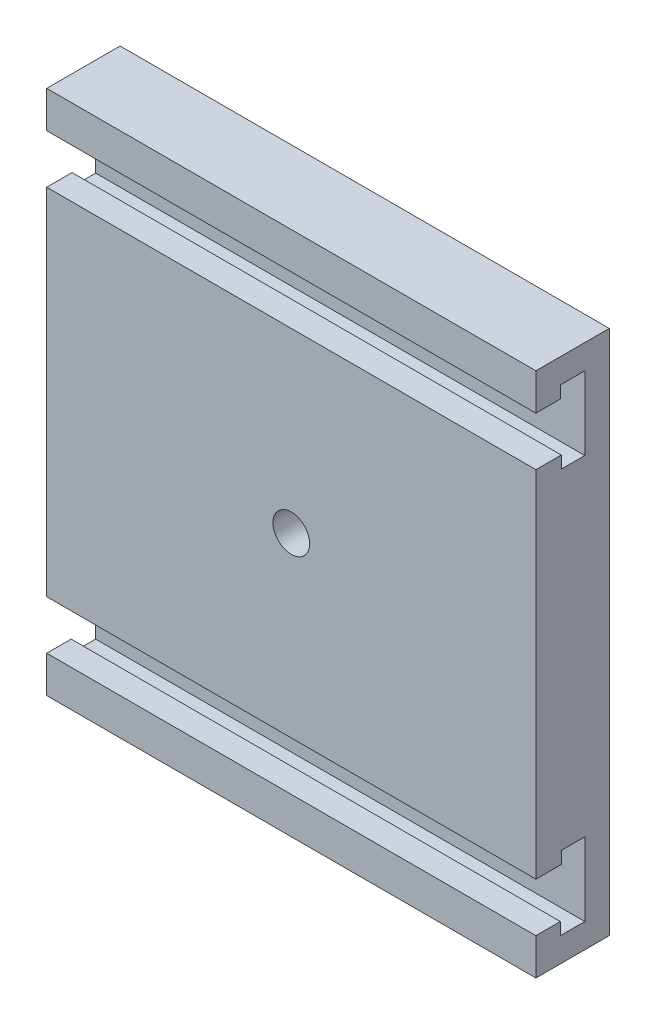
ISO-10303-21;
HEADER;
FILE_DESCRIPTION(('STEP AP214'),'2;1');
FILE_NAME('part.step','',(''),(''),'','','');
FILE_SCHEMA(('AUTOMOTIVE_DESIGN { 1 0 10303 214 1 1 1 1 }'));
ENDSEC;
DATA;
#1=APPLICATION_CONTEXT('core data for automotive mechanical design processes');
#2=APPLICATION_PROTOCOL_DEFINITION('international standard','automotive_design',2000,#1);
#3=PRODUCT_CONTEXT('',#1,'mechanical');
#4=PRODUCT('Part','Part','',(#3));
#5=PRODUCT_RELATED_PRODUCT_CATEGORY('part','',(#4));
#6=PRODUCT_DEFINITION_FORMATION('','',#4);
#7=PRODUCT_DEFINITION_CONTEXT('part definition',#1,'design');
#8=PRODUCT_DEFINITION('design','',#6,#7);
#9=PRODUCT_DEFINITION_SHAPE('','',#8);
#10=(LENGTH_UNIT() NAMED_UNIT(*) SI_UNIT(.MILLI.,.METRE.));
#11=(NAMED_UNIT(*) PLANE_ANGLE_UNIT() SI_UNIT($,.RADIAN.));
#12=(NAMED_UNIT(*) SI_UNIT($,.STERADIAN.) SOLID_ANGLE_UNIT());
#13=UNCERTAINTY_MEASURE_WITH_UNIT(LENGTH_MEASURE(1.E-05),#10,'distance_accuracy_value','');
#14=(GEOMETRIC_REPRESENTATION_CONTEXT(3) GLOBAL_UNCERTAINTY_ASSIGNED_CONTEXT((#13)) GLOBAL_UNIT_ASSIGNED_CONTEXT((#10,
#11,#12)) REPRESENTATION_CONTEXT('',''));
#15=CARTESIAN_POINT('',(0.,0.,0.));
#16=DIRECTION('',(0.,0.,1.));
#17=DIRECTION('',(1.,0.,0.));
#18=AXIS2_PLACEMENT_3D('',#15,#16,#17);
#19=CARTESIAN_POINT('',(0.,0.,6.));
#20=DIRECTION('',(0.,0.,-1.));
#21=DIRECTION('',(-1.,0.,0.));
#22=AXIS2_PLACEMENT_3D('',#19,#20,#21);
#23=PLANE('',#22);
#24=DIRECTION('',(0.,-1.,0.));
#25=VECTOR('',#24,1.);
#26=CARTESIAN_POINT('',(-20.,-21.5,6.));
#27=LINE('',#26,#25);
#28=CARTESIAN_POINT('',(-20.,21.5,6.));
#29=VERTEX_POINT('',#28);
#30=CARTESIAN_POINT('',(-20.,18.5,6.));
#31=VERTEX_POINT('',#30);
#32=EDGE_CURVE('E198',#29,#31,#27,.T.);
#33=ORIENTED_EDGE('',*,*,#32,.T.);
#34=DIRECTION('',(1.,0.,0.));
#35=VECTOR('',#34,1.);
#36=CARTESIAN_POINT('',(-20.,18.5,6.));
#37=LINE('',#36,#35);
#38=CARTESIAN_POINT('',(20.,18.5,6.));
#39=VERTEX_POINT('',#38);
#40=EDGE_CURVE('E256',#31,#39,#37,.T.);
#41=ORIENTED_EDGE('',*,*,#40,.T.);
#42=DIRECTION('',(0.,1.,0.));
#43=VECTOR('',#42,1.);
#44=CARTESIAN_POINT('',(20.,-21.5,6.));
#45=LINE('',#44,#43);
#46=CARTESIAN_POINT('',(20.,21.5,6.));
#47=VERTEX_POINT('',#46);
#48=EDGE_CURVE('E219',#39,#47,#45,.T.);
#49=ORIENTED_EDGE('',*,*,#48,.T.);
#50=DIRECTION('',(-1.,0.,0.));
#51=VECTOR('',#50,1.);
#52=CARTESIAN_POINT('',(-20.,21.5,6.));
#53=LINE('',#52,#51);
#54=EDGE_CURVE('E203',#47,#29,#53,.T.);
#55=ORIENTED_EDGE('',*,*,#54,.T.);
#56=EDGE_LOOP('',(#33,#41,#49,#55));
#57=FACE_BOUND('',#56,.T.);
#58=ADVANCED_FACE('F34',(#57),#23,.F.);
#59=CARTESIAN_POINT('',(20.,-21.5,6.));
#60=VERTEX_POINT('',#59);
#61=CARTESIAN_POINT('',(20.,-18.5,6.));
#62=VERTEX_POINT('',#61);
#63=EDGE_CURVE('E247',#60,#62,#45,.T.);
#64=ORIENTED_EDGE('',*,*,#63,.T.);
#65=DIRECTION('',(1.,0.,0.));
#66=VECTOR('',#65,1.);
#67=CARTESIAN_POINT('',(-20.,-18.5,6.));
#68=LINE('',#67,#66);
#69=CARTESIAN_POINT('',(-20.,-18.5,6.));
#70=VERTEX_POINT('',#69);
#71=EDGE_CURVE('E401',#70,#62,#68,.T.);
#72=ORIENTED_EDGE('',*,*,#71,.F.);
#73=CARTESIAN_POINT('',(-20.,-21.5,6.));
#74=VERTEX_POINT('',#73);
#75=EDGE_CURVE('E199',#70,#74,#27,.T.);
#76=ORIENTED_EDGE('',*,*,#75,.T.);
#77=DIRECTION('',(1.,0.,0.));
#78=VECTOR('',#77,1.);
#79=CARTESIAN_POINT('',(-20.,-21.5,6.));
#80=LINE('',#79,#78);
#81=EDGE_CURVE('E202',#74,#60,#80,.T.);
#82=ORIENTED_EDGE('',*,*,#81,.T.);
#83=EDGE_LOOP('',(#64,#72,#76,#82));
#84=FACE_BOUND('',#83,.T.);
#85=ADVANCED_FACE('F266',(#84),#23,.F.);
#86=CARTESIAN_POINT('',(20.,-14.5,6.));
#87=VERTEX_POINT('',#86);
#88=CARTESIAN_POINT('',(20.,14.5,6.));
#89=VERTEX_POINT('',#88);
#90=EDGE_CURVE('E189',#87,#89,#45,.T.);
#91=ORIENTED_EDGE('',*,*,#90,.T.);
#92=DIRECTION('',(1.,0.,0.));
#93=VECTOR('',#92,1.);
#94=CARTESIAN_POINT('',(-20.,14.5,6.));
#95=LINE('',#94,#93);
#96=CARTESIAN_POINT('',(-20.,14.5,6.));
#97=VERTEX_POINT('',#96);
#98=EDGE_CURVE('E174',#97,#89,#95,.T.);
#99=ORIENTED_EDGE('',*,*,#98,.F.);
#100=CARTESIAN_POINT('',(-20.,-14.5,6.));
#101=VERTEX_POINT('',#100);
#102=EDGE_CURVE('E187',#97,#101,#27,.T.);
#103=ORIENTED_EDGE('',*,*,#102,.T.);
#104=DIRECTION('',(1.,0.,0.));
#105=VECTOR('',#104,1.);
#106=CARTESIAN_POINT('',(-20.,-14.5,6.));
#107=LINE('',#106,#105);
#108=EDGE_CURVE('E404',#101,#87,#107,.T.);
#109=ORIENTED_EDGE('',*,*,#108,.T.);
#110=EDGE_LOOP('',(#91,#99,#103,#109));
#111=FACE_BOUND('',#110,.T.);
#112=CARTESIAN_POINT('',(0.,0.,6.));
#113=DIRECTION('',(0.,0.,1.));
#114=DIRECTION('',(1.,0.,0.));
#115=AXIS2_PLACEMENT_3D('',#112,#113,#114);
#116=CIRCLE('',#115,1.5);
#117=CARTESIAN_POINT('',(1.50000000000001,0.,6.));
#118=VERTEX_POINT('',#117);
#119=EDGE_CURVE('E213',#118,#118,#116,.T.);
#120=ORIENTED_EDGE('',*,*,#119,.F.);
#121=EDGE_LOOP('',(#120));
#122=FACE_BOUND('',#121,.T.);
#123=ADVANCED_FACE('F184',(#111,#122),#23,.F.);
#124=CARTESIAN_POINT('',(0.,0.,0.));
#125=DIRECTION('',(0.,0.,-1.));
#126=DIRECTION('',(-1.,0.,0.));
#127=AXIS2_PLACEMENT_3D('',#124,#125,#126);
#128=PLANE('',#127);
#129=DIRECTION('',(0.,1.,0.));
#130=VECTOR('',#129,1.);
#131=CARTESIAN_POINT('',(20.,-21.5,0.));
#132=LINE('',#131,#130);
#133=CARTESIAN_POINT('',(20.,-21.5,0.));
#134=VERTEX_POINT('',#133);
#135=CARTESIAN_POINT('',(20.,21.5,0.));
#136=VERTEX_POINT('',#135);
#137=EDGE_CURVE('E209',#134,#136,#132,.T.);
#138=ORIENTED_EDGE('',*,*,#137,.F.);
#139=DIRECTION('',(1.,0.,0.));
#140=VECTOR('',#139,1.);
#141=CARTESIAN_POINT('',(-20.,-21.5,0.));
#142=LINE('',#141,#140);
#143=CARTESIAN_POINT('',(-20.,-21.5,0.));
#144=VERTEX_POINT('',#143);
#145=EDGE_CURVE('E217',#144,#134,#142,.T.);
#146=ORIENTED_EDGE('',*,*,#145,.F.);
#147=DIRECTION('',(0.,-1.,0.));
#148=VECTOR('',#147,1.);
#149=CARTESIAN_POINT('',(-20.,-21.5,0.));
#150=LINE('',#149,#148);
#151=CARTESIAN_POINT('',(-20.,21.5,0.));
#152=VERTEX_POINT('',#151);
#153=EDGE_CURVE('E215',#152,#144,#150,.T.);
#154=ORIENTED_EDGE('',*,*,#153,.F.);
#155=DIRECTION('',(-1.,0.,0.));
#156=VECTOR('',#155,1.);
#157=CARTESIAN_POINT('',(-20.,21.5,0.));
#158=LINE('',#157,#156);
#159=EDGE_CURVE('E212',#136,#152,#158,.T.);
#160=ORIENTED_EDGE('',*,*,#159,.F.);
#161=EDGE_LOOP('',(#138,#146,#154,#160));
#162=FACE_BOUND('',#161,.T.);
#163=CARTESIAN_POINT('',(0.,0.,0.));
#164=DIRECTION('',(0.,0.,1.));
#165=DIRECTION('',(1.,0.,0.));
#166=AXIS2_PLACEMENT_3D('',#163,#164,#165);
#167=CIRCLE('',#166,1.5);
#168=CARTESIAN_POINT('',(1.50000000000001,0.,0.));
#169=VERTEX_POINT('',#168);
#170=EDGE_CURVE('E355',#169,#169,#167,.T.);
#171=ORIENTED_EDGE('',*,*,#170,.T.);
#172=EDGE_LOOP('',(#171));
#173=FACE_BOUND('',#172,.T.);
#174=ADVANCED_FACE('F235',(#162,#173),#128,.T.);
#175=CARTESIAN_POINT('',(20.,-21.5,6.));
#176=DIRECTION('',(-1.,0.,0.));
#177=DIRECTION('',(0.,0.,1.));
#178=AXIS2_PLACEMENT_3D('',#175,#176,#177);
#179=PLANE('',#178);
#180=ORIENTED_EDGE('',*,*,#48,.F.);
#181=DIRECTION('',(0.,0.,1.));
#182=VECTOR('',#181,1.);
#183=CARTESIAN_POINT('',(20.,18.5,6.));
#184=LINE('',#183,#182);
#185=CARTESIAN_POINT('',(20.,18.5,4.));
#186=VERTEX_POINT('',#185);
#187=EDGE_CURVE('E179',#186,#39,#184,.T.);
#188=ORIENTED_EDGE('',*,*,#187,.F.);
#189=DIRECTION('',(0.,-1.,0.));
#190=VECTOR('',#189,1.);
#191=CARTESIAN_POINT('',(20.,18.5,4.));
#192=LINE('',#191,#190);
#193=CARTESIAN_POINT('',(20.,19.5,4.));
#194=VERTEX_POINT('',#193);
#195=EDGE_CURVE('E348',#194,#186,#192,.T.);
#196=ORIENTED_EDGE('',*,*,#195,.F.);
#197=DIRECTION('',(0.,0.,1.));
#198=VECTOR('',#197,1.);
#199=CARTESIAN_POINT('',(20.,19.5,4.));
#200=LINE('',#199,#198);
#201=CARTESIAN_POINT('',(20.,19.5,2.));
#202=VERTEX_POINT('',#201);
#203=EDGE_CURVE('E350',#202,#194,#200,.T.);
#204=ORIENTED_EDGE('',*,*,#203,.F.);
#205=DIRECTION('',(0.,1.,0.));
#206=VECTOR('',#205,1.);
#207=CARTESIAN_POINT('',(20.,19.5,2.));
#208=LINE('',#207,#206);
#209=CARTESIAN_POINT('',(20.,13.5,2.));
#210=VERTEX_POINT('',#209);
#211=EDGE_CURVE('E442',#210,#202,#208,.T.);
#212=ORIENTED_EDGE('',*,*,#211,.F.);
#213=DIRECTION('',(0.,0.,-1.));
#214=VECTOR('',#213,1.);
#215=CARTESIAN_POINT('',(20.,13.5,2.));
#216=LINE('',#215,#214);
#217=CARTESIAN_POINT('',(20.,13.5,3.92597341943154));
#218=VERTEX_POINT('',#217);
#219=EDGE_CURVE('E435',#218,#210,#216,.T.);
#220=ORIENTED_EDGE('',*,*,#219,.F.);
#221=DIRECTION('',(0.,-1.,0.));
#222=VECTOR('',#221,1.);
#223=CARTESIAN_POINT('',(20.,13.5,3.92597341943154));
#224=LINE('',#223,#222);
#225=CARTESIAN_POINT('',(20.,14.5,3.92597341943154));
#226=VERTEX_POINT('',#225);
#227=EDGE_CURVE('E433',#226,#218,#224,.T.);
#228=ORIENTED_EDGE('',*,*,#227,.F.);
#229=DIRECTION('',(0.,0.,-1.));
#230=VECTOR('',#229,1.);
#231=CARTESIAN_POINT('',(20.,14.5,3.92597341943154));
#232=LINE('',#231,#230);
#233=EDGE_CURVE('E403',#89,#226,#232,.T.);
#234=ORIENTED_EDGE('',*,*,#233,.F.);
#235=ORIENTED_EDGE('',*,*,#90,.F.);
#236=DIRECTION('',(0.,0.,1.));
#237=VECTOR('',#236,1.);
#238=CARTESIAN_POINT('',(20.,-14.5,3.92597341943154));
#239=LINE('',#238,#237);
#240=CARTESIAN_POINT('',(20.,-14.5,3.92597341943154));
#241=VERTEX_POINT('',#240);
#242=EDGE_CURVE('E370',#241,#87,#239,.T.);
#243=ORIENTED_EDGE('',*,*,#242,.F.);
#244=DIRECTION('',(0.,-1.,0.));
#245=VECTOR('',#244,1.);
#246=CARTESIAN_POINT('',(20.,-13.5,3.92597341943154));
#247=LINE('',#246,#245);
#248=CARTESIAN_POINT('',(20.,-13.5,3.92597341943154));
#249=VERTEX_POINT('',#248);
#250=EDGE_CURVE('E397',#249,#241,#247,.T.);
#251=ORIENTED_EDGE('',*,*,#250,.F.);
#252=DIRECTION('',(0.,0.,1.));
#253=VECTOR('',#252,1.);
#254=CARTESIAN_POINT('',(20.,-13.5,2.));
#255=LINE('',#254,#253);
#256=CARTESIAN_POINT('',(20.,-13.5,2.));
#257=VERTEX_POINT('',#256);
#258=EDGE_CURVE('E394',#257,#249,#255,.T.);
#259=ORIENTED_EDGE('',*,*,#258,.F.);
#260=DIRECTION('',(0.,1.,0.));
#261=VECTOR('',#260,1.);
#262=CARTESIAN_POINT('',(20.,-19.5,2.));
#263=LINE('',#262,#261);
#264=CARTESIAN_POINT('',(20.,-19.5,2.));
#265=VERTEX_POINT('',#264);
#266=EDGE_CURVE('E391',#265,#257,#263,.T.);
#267=ORIENTED_EDGE('',*,*,#266,.F.);
#268=DIRECTION('',(0.,0.,-1.));
#269=VECTOR('',#268,1.);
#270=CARTESIAN_POINT('',(20.,-19.5,4.));
#271=LINE('',#270,#269);
#272=CARTESIAN_POINT('',(20.,-19.5,4.));
#273=VERTEX_POINT('',#272);
#274=EDGE_CURVE('E388',#273,#265,#271,.T.);
#275=ORIENTED_EDGE('',*,*,#274,.F.);
#276=DIRECTION('',(0.,-1.,0.));
#277=VECTOR('',#276,1.);
#278=CARTESIAN_POINT('',(20.,-18.5,4.));
#279=LINE('',#278,#277);
#280=CARTESIAN_POINT('',(20.,-18.5,4.));
#281=VERTEX_POINT('',#280);
#282=EDGE_CURVE('E385',#281,#273,#279,.T.);
#283=ORIENTED_EDGE('',*,*,#282,.F.);
#284=DIRECTION('',(0.,0.,-1.));
#285=VECTOR('',#284,1.);
#286=CARTESIAN_POINT('',(20.,-18.5,6.));
#287=LINE('',#286,#285);
#288=EDGE_CURVE('E250',#62,#281,#287,.T.);
#289=ORIENTED_EDGE('',*,*,#288,.F.);
#290=ORIENTED_EDGE('',*,*,#63,.F.);
#291=DIRECTION('',(0.,0.,-1.));
#292=VECTOR('',#291,1.);
#293=CARTESIAN_POINT('',(20.,-21.5,6.));
#294=LINE('',#293,#292);
#295=EDGE_CURVE('E208',#60,#134,#294,.T.);
#296=ORIENTED_EDGE('',*,*,#295,.T.);
#297=ORIENTED_EDGE('',*,*,#137,.T.);
#298=DIRECTION('',(0.,0.,-1.));
#299=VECTOR('',#298,1.);
#300=CARTESIAN_POINT('',(20.,21.5,6.));
#301=LINE('',#300,#299);
#302=EDGE_CURVE('E11',#47,#136,#301,.T.);
#303=ORIENTED_EDGE('',*,*,#302,.F.);
#304=EDGE_LOOP('',(#180,#188,#196,#204,#212,#220,#228,#234,#235,#243,#251,#259,#267,#275,#283,
#289,#290,#296,#297,#303));
#305=FACE_BOUND('',#304,.T.);
#306=ADVANCED_FACE('F36',(#305),#179,.F.);
#307=CARTESIAN_POINT('',(-20.,21.5,6.));
#308=DIRECTION('',(0.,-1.,0.));
#309=DIRECTION('',(0.,0.,-1.));
#310=AXIS2_PLACEMENT_3D('',#307,#308,#309);
#311=PLANE('',#310);
#312=ORIENTED_EDGE('',*,*,#159,.T.);
#313=DIRECTION('',(0.,0.,-1.));
#314=VECTOR('',#313,1.);
#315=CARTESIAN_POINT('',(-20.,21.5,6.));
#316=LINE('',#315,#314);
#317=EDGE_CURVE('E42',#29,#152,#316,.T.);
#318=ORIENTED_EDGE('',*,*,#317,.F.);
#319=ORIENTED_EDGE('',*,*,#54,.F.);
#320=ORIENTED_EDGE('',*,*,#302,.T.);
#321=EDGE_LOOP('',(#312,#318,#319,#320));
#322=FACE_BOUND('',#321,.T.);
#323=ADVANCED_FACE('F258',(#322),#311,.F.);
#324=CARTESIAN_POINT('',(-20.,-21.5,6.));
#325=DIRECTION('',(1.,0.,0.));
#326=DIRECTION('',(0.,0.,-1.));
#327=AXIS2_PLACEMENT_3D('',#324,#325,#326);
#328=PLANE('',#327);
#329=DIRECTION('',(0.,-1.,0.));
#330=VECTOR('',#329,1.);
#331=CARTESIAN_POINT('',(-20.,18.5,4.));
#332=LINE('',#331,#330);
#333=CARTESIAN_POINT('',(-20.,19.5,4.));
#334=VERTEX_POINT('',#333);
#335=CARTESIAN_POINT('',(-20.,18.5,4.));
#336=VERTEX_POINT('',#335);
#337=EDGE_CURVE('E449',#334,#336,#332,.T.);
#338=ORIENTED_EDGE('',*,*,#337,.T.);
#339=DIRECTION('',(0.,0.,1.));
#340=VECTOR('',#339,1.);
#341=CARTESIAN_POINT('',(-20.,18.5,6.));
#342=LINE('',#341,#340);
#343=EDGE_CURVE('E190',#336,#31,#342,.T.);
#344=ORIENTED_EDGE('',*,*,#343,.T.);
#345=ORIENTED_EDGE('',*,*,#32,.F.);
#346=ORIENTED_EDGE('',*,*,#317,.T.);
#347=ORIENTED_EDGE('',*,*,#153,.T.);
#348=DIRECTION('',(0.,0.,-1.));
#349=VECTOR('',#348,1.);
#350=CARTESIAN_POINT('',(-20.,-21.5,6.));
#351=LINE('',#350,#349);
#352=EDGE_CURVE('E222',#74,#144,#351,.T.);
#353=ORIENTED_EDGE('',*,*,#352,.F.);
#354=ORIENTED_EDGE('',*,*,#75,.F.);
#355=DIRECTION('',(0.,0.,-1.));
#356=VECTOR('',#355,1.);
#357=CARTESIAN_POINT('',(-20.,-18.5,6.));
#358=LINE('',#357,#356);
#359=CARTESIAN_POINT('',(-20.,-18.5,4.));
#360=VERTEX_POINT('',#359);
#361=EDGE_CURVE('E366',#70,#360,#358,.T.);
#362=ORIENTED_EDGE('',*,*,#361,.T.);
#363=DIRECTION('',(0.,-1.,0.));
#364=VECTOR('',#363,1.);
#365=CARTESIAN_POINT('',(-20.,-18.5,4.));
#366=LINE('',#365,#364);
#367=CARTESIAN_POINT('',(-20.,-19.5,4.));
#368=VERTEX_POINT('',#367);
#369=EDGE_CURVE('E369',#360,#368,#366,.T.);
#370=ORIENTED_EDGE('',*,*,#369,.T.);
#371=DIRECTION('',(0.,0.,-1.));
#372=VECTOR('',#371,1.);
#373=CARTESIAN_POINT('',(-20.,-19.5,4.));
#374=LINE('',#373,#372);
#375=CARTESIAN_POINT('',(-20.,-19.5,2.));
#376=VERTEX_POINT('',#375);
#377=EDGE_CURVE('E57',#368,#376,#374,.T.);
#378=ORIENTED_EDGE('',*,*,#377,.T.);
#379=DIRECTION('',(0.,1.,0.));
#380=VECTOR('',#379,1.);
#381=CARTESIAN_POINT('',(-20.,-19.5,2.));
#382=LINE('',#381,#380);
#383=CARTESIAN_POINT('',(-20.,-13.5,2.));
#384=VERTEX_POINT('',#383);
#385=EDGE_CURVE('E374',#376,#384,#382,.T.);
#386=ORIENTED_EDGE('',*,*,#385,.T.);
#387=DIRECTION('',(0.,0.,1.));
#388=VECTOR('',#387,1.);
#389=CARTESIAN_POINT('',(-20.,-13.5,2.));
#390=LINE('',#389,#388);
#391=CARTESIAN_POINT('',(-20.,-13.5,3.92597341943154));
#392=VERTEX_POINT('',#391);
#393=EDGE_CURVE('E377',#384,#392,#390,.T.);
#394=ORIENTED_EDGE('',*,*,#393,.T.);
#395=DIRECTION('',(0.,-1.,0.));
#396=VECTOR('',#395,1.);
#397=CARTESIAN_POINT('',(-20.,-13.5,3.92597341943154));
#398=LINE('',#397,#396);
#399=CARTESIAN_POINT('',(-20.,-14.5,3.92597341943154));
#400=VERTEX_POINT('',#399);
#401=EDGE_CURVE('E380',#392,#400,#398,.T.);
#402=ORIENTED_EDGE('',*,*,#401,.T.);
#403=DIRECTION('',(0.,0.,1.));
#404=VECTOR('',#403,1.);
#405=CARTESIAN_POINT('',(-20.,-14.5,3.92597341943154));
#406=LINE('',#405,#404);
#407=EDGE_CURVE('E197',#400,#101,#406,.T.);
#408=ORIENTED_EDGE('',*,*,#407,.T.);
#409=ORIENTED_EDGE('',*,*,#102,.F.);
#410=DIRECTION('',(0.,0.,-1.));
#411=VECTOR('',#410,1.);
#412=CARTESIAN_POINT('',(-20.,14.5,3.92597341943154));
#413=LINE('',#412,#411);
#414=CARTESIAN_POINT('',(-20.,14.5,3.92597341943154));
#415=VERTEX_POINT('',#414);
#416=EDGE_CURVE('E170',#97,#415,#413,.T.);
#417=ORIENTED_EDGE('',*,*,#416,.T.);
#418=DIRECTION('',(0.,-1.,0.));
#419=VECTOR('',#418,1.);
#420=CARTESIAN_POINT('',(-20.,13.5,3.92597341943154));
#421=LINE('',#420,#419);
#422=CARTESIAN_POINT('',(-20.,13.5,3.92597341943154));
#423=VERTEX_POINT('',#422);
#424=EDGE_CURVE('E49',#415,#423,#421,.T.);
#425=ORIENTED_EDGE('',*,*,#424,.T.);
#426=DIRECTION('',(0.,0.,-1.));
#427=VECTOR('',#426,1.);
#428=CARTESIAN_POINT('',(-20.,13.5,2.));
#429=LINE('',#428,#427);
#430=CARTESIAN_POINT('',(-20.,13.5,2.));
#431=VERTEX_POINT('',#430);
#432=EDGE_CURVE('E457',#423,#431,#429,.T.);
#433=ORIENTED_EDGE('',*,*,#432,.T.);
#434=DIRECTION('',(0.,1.,0.));
#435=VECTOR('',#434,1.);
#436=CARTESIAN_POINT('',(-20.,19.5,2.));
#437=LINE('',#436,#435);
#438=CARTESIAN_POINT('',(-20.,19.5,2.));
#439=VERTEX_POINT('',#438);
#440=EDGE_CURVE('E455',#431,#439,#437,.T.);
#441=ORIENTED_EDGE('',*,*,#440,.T.);
#442=DIRECTION('',(0.,0.,1.));
#443=VECTOR('',#442,1.);
#444=CARTESIAN_POINT('',(-20.,19.5,4.));
#445=LINE('',#444,#443);
#446=EDGE_CURVE('E451',#439,#334,#445,.T.);
#447=ORIENTED_EDGE('',*,*,#446,.T.);
#448=EDGE_LOOP('',(#338,#344,#345,#346,#347,#353,#354,#362,#370,#378,#386,#394,#402,#408,#409,
#417,#425,#433,#441,#447));
#449=FACE_BOUND('',#448,.T.);
#450=ADVANCED_FACE('F194',(#449),#328,.F.);
#451=CARTESIAN_POINT('',(-20.,-21.5,6.));
#452=DIRECTION('',(0.,1.,0.));
#453=DIRECTION('',(0.,0.,1.));
#454=AXIS2_PLACEMENT_3D('',#451,#452,#453);
#455=PLANE('',#454);
#456=ORIENTED_EDGE('',*,*,#145,.T.);
#457=ORIENTED_EDGE('',*,*,#295,.F.);
#458=ORIENTED_EDGE('',*,*,#81,.F.);
#459=ORIENTED_EDGE('',*,*,#352,.T.);
#460=EDGE_LOOP('',(#456,#457,#458,#459));
#461=FACE_BOUND('',#460,.T.);
#462=ADVANCED_FACE('F239',(#461),#455,.F.);
#463=CARTESIAN_POINT('',(0.,0.,6.));
#464=DIRECTION('',(0.,0.,-1.));
#465=DIRECTION('',(-1.,0.,0.));
#466=AXIS2_PLACEMENT_3D('',#463,#464,#465);
#467=CYLINDRICAL_SURFACE('',#466,1.5);
#468=ORIENTED_EDGE('',*,*,#119,.T.);
#469=EDGE_LOOP('',(#468));
#470=FACE_BOUND('',#469,.T.);
#471=ORIENTED_EDGE('',*,*,#170,.F.);
#472=EDGE_LOOP('',(#471));
#473=FACE_BOUND('',#472,.T.);
#474=ADVANCED_FACE('F281',(#470,#473),#467,.F.);
#475=CARTESIAN_POINT('',(-20.,-18.5,6.));
#476=DIRECTION('',(0.,-1.,0.));
#477=DIRECTION('',(0.,0.,-1.));
#478=AXIS2_PLACEMENT_3D('',#475,#476,#477);
#479=PLANE('',#478);
#480=ORIENTED_EDGE('',*,*,#288,.T.);
#481=DIRECTION('',(1.,0.,0.));
#482=VECTOR('',#481,1.);
#483=CARTESIAN_POINT('',(-20.,-18.5,4.));
#484=LINE('',#483,#482);
#485=EDGE_CURVE('E383',#360,#281,#484,.T.);
#486=ORIENTED_EDGE('',*,*,#485,.F.);
#487=ORIENTED_EDGE('',*,*,#361,.F.);
#488=ORIENTED_EDGE('',*,*,#71,.T.);
#489=EDGE_LOOP('',(#480,#486,#487,#488));
#490=FACE_BOUND('',#489,.T.);
#491=ADVANCED_FACE('F285',(#490),#479,.F.);
#492=CARTESIAN_POINT('',(-20.,-14.5,3.92597341943154));
#493=DIRECTION('',(0.,1.,0.));
#494=DIRECTION('',(0.,0.,1.));
#495=AXIS2_PLACEMENT_3D('',#492,#493,#494);
#496=PLANE('',#495);
#497=ORIENTED_EDGE('',*,*,#242,.T.);
#498=ORIENTED_EDGE('',*,*,#108,.F.);
#499=ORIENTED_EDGE('',*,*,#407,.F.);
#500=DIRECTION('',(1.,0.,0.));
#501=VECTOR('',#500,1.);
#502=CARTESIAN_POINT('',(-20.,-14.5,3.92597341943154));
#503=LINE('',#502,#501);
#504=EDGE_CURVE('E406',#400,#241,#503,.T.);
#505=ORIENTED_EDGE('',*,*,#504,.T.);
#506=EDGE_LOOP('',(#497,#498,#499,#505));
#507=FACE_BOUND('',#506,.T.);
#508=ADVANCED_FACE('F290',(#507),#496,.F.);
#509=CARTESIAN_POINT('',(-20.,-13.5,3.92597341943154));
#510=DIRECTION('',(0.,0.,1.));
#511=DIRECTION('',(1.,0.,0.));
#512=AXIS2_PLACEMENT_3D('',#509,#510,#511);
#513=PLANE('',#512);
#514=ORIENTED_EDGE('',*,*,#250,.T.);
#515=ORIENTED_EDGE('',*,*,#504,.F.);
#516=ORIENTED_EDGE('',*,*,#401,.F.);
#517=DIRECTION('',(1.,0.,0.));
#518=VECTOR('',#517,1.);
#519=CARTESIAN_POINT('',(-20.,-13.5,3.92597341943154));
#520=LINE('',#519,#518);
#521=EDGE_CURVE('E408',#392,#249,#520,.T.);
#522=ORIENTED_EDGE('',*,*,#521,.T.);
#523=EDGE_LOOP('',(#514,#515,#516,#522));
#524=FACE_BOUND('',#523,.T.);
#525=ADVANCED_FACE('F311',(#524),#513,.F.);
#526=CARTESIAN_POINT('',(-20.,-13.5,2.));
#527=DIRECTION('',(0.,1.,0.));
#528=DIRECTION('',(0.,0.,1.));
#529=AXIS2_PLACEMENT_3D('',#526,#527,#528);
#530=PLANE('',#529);
#531=ORIENTED_EDGE('',*,*,#258,.T.);
#532=ORIENTED_EDGE('',*,*,#521,.F.);
#533=ORIENTED_EDGE('',*,*,#393,.F.);
#534=DIRECTION('',(1.,0.,0.));
#535=VECTOR('',#534,1.);
#536=CARTESIAN_POINT('',(-20.,-13.5,2.));
#537=LINE('',#536,#535);
#538=EDGE_CURVE('E410',#384,#257,#537,.T.);
#539=ORIENTED_EDGE('',*,*,#538,.T.);
#540=EDGE_LOOP('',(#531,#532,#533,#539));
#541=FACE_BOUND('',#540,.T.);
#542=ADVANCED_FACE('F307',(#541),#530,.F.);
#543=CARTESIAN_POINT('',(-20.,-19.5,2.));
#544=DIRECTION('',(0.,0.,-1.));
#545=DIRECTION('',(0.,1.,0.));
#546=AXIS2_PLACEMENT_3D('',#543,#544,#545);
#547=PLANE('',#546);
#548=ORIENTED_EDGE('',*,*,#266,.T.);
#549=ORIENTED_EDGE('',*,*,#538,.F.);
#550=ORIENTED_EDGE('',*,*,#385,.F.);
#551=DIRECTION('',(1.,0.,0.));
#552=VECTOR('',#551,1.);
#553=CARTESIAN_POINT('',(-20.,-19.5,2.));
#554=LINE('',#553,#552);
#555=EDGE_CURVE('E412',#376,#265,#554,.T.);
#556=ORIENTED_EDGE('',*,*,#555,.T.);
#557=EDGE_LOOP('',(#548,#549,#550,#556));
#558=FACE_BOUND('',#557,.T.);
#559=ADVANCED_FACE('F304',(#558),#547,.F.);
#560=CARTESIAN_POINT('',(-20.,-19.5,4.));
#561=DIRECTION('',(0.,-1.,0.));
#562=DIRECTION('',(0.,0.,-1.));
#563=AXIS2_PLACEMENT_3D('',#560,#561,#562);
#564=PLANE('',#563);
#565=ORIENTED_EDGE('',*,*,#274,.T.);
#566=ORIENTED_EDGE('',*,*,#555,.F.);
#567=ORIENTED_EDGE('',*,*,#377,.F.);
#568=DIRECTION('',(1.,0.,0.));
#569=VECTOR('',#568,1.);
#570=CARTESIAN_POINT('',(-20.,-19.5,4.));
#571=LINE('',#570,#569);
#572=EDGE_CURVE('E414',#368,#273,#571,.T.);
#573=ORIENTED_EDGE('',*,*,#572,.T.);
#574=EDGE_LOOP('',(#565,#566,#567,#573));
#575=FACE_BOUND('',#574,.T.);
#576=ADVANCED_FACE('F300',(#575),#564,.F.);
#577=CARTESIAN_POINT('',(-20.,-18.5,4.));
#578=DIRECTION('',(0.,0.,1.));
#579=DIRECTION('',(1.,0.,0.));
#580=AXIS2_PLACEMENT_3D('',#577,#578,#579);
#581=PLANE('',#580);
#582=ORIENTED_EDGE('',*,*,#282,.T.);
#583=ORIENTED_EDGE('',*,*,#572,.F.);
#584=ORIENTED_EDGE('',*,*,#369,.F.);
#585=ORIENTED_EDGE('',*,*,#485,.T.);
#586=EDGE_LOOP('',(#582,#583,#584,#585));
#587=FACE_BOUND('',#586,.T.);
#588=ADVANCED_FACE('F296',(#587),#581,.F.);
#589=CARTESIAN_POINT('',(-20.,18.5,6.));
#590=DIRECTION('',(0.,1.,0.));
#591=DIRECTION('',(0.,0.,1.));
#592=AXIS2_PLACEMENT_3D('',#589,#590,#591);
#593=PLANE('',#592);
#594=ORIENTED_EDGE('',*,*,#187,.T.);
#595=ORIENTED_EDGE('',*,*,#40,.F.);
#596=ORIENTED_EDGE('',*,*,#343,.F.);
#597=DIRECTION('',(1.,0.,0.));
#598=VECTOR('',#597,1.);
#599=CARTESIAN_POINT('',(-20.,18.5,4.));
#600=LINE('',#599,#598);
#601=EDGE_CURVE('E345',#336,#186,#600,.T.);
#602=ORIENTED_EDGE('',*,*,#601,.T.);
#603=EDGE_LOOP('',(#594,#595,#596,#602));
#604=FACE_BOUND('',#603,.T.);
#605=ADVANCED_FACE('F299',(#604),#593,.F.);
#606=CARTESIAN_POINT('',(-20.,18.5,4.));
#607=DIRECTION('',(0.,0.,1.));
#608=DIRECTION('',(1.,0.,0.));
#609=AXIS2_PLACEMENT_3D('',#606,#607,#608);
#610=PLANE('',#609);
#611=ORIENTED_EDGE('',*,*,#195,.T.);
#612=ORIENTED_EDGE('',*,*,#601,.F.);
#613=ORIENTED_EDGE('',*,*,#337,.F.);
#614=DIRECTION('',(1.,0.,0.));
#615=VECTOR('',#614,1.);
#616=CARTESIAN_POINT('',(-20.,19.5,4.));
#617=LINE('',#616,#615);
#618=EDGE_CURVE('E357',#334,#194,#617,.T.);
#619=ORIENTED_EDGE('',*,*,#618,.T.);
#620=EDGE_LOOP('',(#611,#612,#613,#619));
#621=FACE_BOUND('',#620,.T.);
#622=ADVANCED_FACE('F335',(#621),#610,.F.);
#623=CARTESIAN_POINT('',(-20.,19.5,4.));
#624=DIRECTION('',(0.,1.,0.));
#625=DIRECTION('',(0.,0.,1.));
#626=AXIS2_PLACEMENT_3D('',#623,#624,#625);
#627=PLANE('',#626);
#628=ORIENTED_EDGE('',*,*,#203,.T.);
#629=ORIENTED_EDGE('',*,*,#618,.F.);
#630=ORIENTED_EDGE('',*,*,#446,.F.);
#631=DIRECTION('',(1.,0.,0.));
#632=VECTOR('',#631,1.);
#633=CARTESIAN_POINT('',(-20.,19.5,2.));
#634=LINE('',#633,#632);
#635=EDGE_CURVE('E359',#439,#202,#634,.T.);
#636=ORIENTED_EDGE('',*,*,#635,.T.);
#637=EDGE_LOOP('',(#628,#629,#630,#636));
#638=FACE_BOUND('',#637,.T.);
#639=ADVANCED_FACE('F331',(#638),#627,.F.);
#640=CARTESIAN_POINT('',(-20.,19.5,2.));
#641=DIRECTION('',(0.,0.,-1.));
#642=DIRECTION('',(0.,1.,0.));
#643=AXIS2_PLACEMENT_3D('',#640,#641,#642);
#644=PLANE('',#643);
#645=ORIENTED_EDGE('',*,*,#211,.T.);
#646=ORIENTED_EDGE('',*,*,#635,.F.);
#647=ORIENTED_EDGE('',*,*,#440,.F.);
#648=DIRECTION('',(1.,0.,0.));
#649=VECTOR('',#648,1.);
#650=CARTESIAN_POINT('',(-20.,13.5,2.));
#651=LINE('',#650,#649);
#652=EDGE_CURVE('E361',#431,#210,#651,.T.);
#653=ORIENTED_EDGE('',*,*,#652,.T.);
#654=EDGE_LOOP('',(#645,#646,#647,#653));
#655=FACE_BOUND('',#654,.T.);
#656=ADVANCED_FACE('F327',(#655),#644,.F.);
#657=CARTESIAN_POINT('',(-20.,13.5,2.));
#658=DIRECTION('',(0.,-1.,0.));
#659=DIRECTION('',(0.,0.,-1.));
#660=AXIS2_PLACEMENT_3D('',#657,#658,#659);
#661=PLANE('',#660);
#662=ORIENTED_EDGE('',*,*,#219,.T.);
#663=ORIENTED_EDGE('',*,*,#652,.F.);
#664=ORIENTED_EDGE('',*,*,#432,.F.);
#665=DIRECTION('',(1.,0.,0.));
#666=VECTOR('',#665,1.);
#667=CARTESIAN_POINT('',(-20.,13.5,3.92597341943154));
#668=LINE('',#667,#666);
#669=EDGE_CURVE('E363',#423,#218,#668,.T.);
#670=ORIENTED_EDGE('',*,*,#669,.T.);
#671=EDGE_LOOP('',(#662,#663,#664,#670));
#672=FACE_BOUND('',#671,.T.);
#673=ADVANCED_FACE('F324',(#672),#661,.F.);
#674=CARTESIAN_POINT('',(-20.,13.5,3.92597341943154));
#675=DIRECTION('',(0.,0.,1.));
#676=DIRECTION('',(1.,0.,0.));
#677=AXIS2_PLACEMENT_3D('',#674,#675,#676);
#678=PLANE('',#677);
#679=ORIENTED_EDGE('',*,*,#227,.T.);
#680=ORIENTED_EDGE('',*,*,#669,.F.);
#681=ORIENTED_EDGE('',*,*,#424,.F.);
#682=DIRECTION('',(1.,0.,0.));
#683=VECTOR('',#682,1.);
#684=CARTESIAN_POINT('',(-20.,14.5,3.92597341943154));
#685=LINE('',#684,#683);
#686=EDGE_CURVE('E176',#415,#226,#685,.T.);
#687=ORIENTED_EDGE('',*,*,#686,.T.);
#688=EDGE_LOOP('',(#679,#680,#681,#687));
#689=FACE_BOUND('',#688,.T.);
#690=ADVANCED_FACE('F321',(#689),#678,.F.);
#691=CARTESIAN_POINT('',(-20.,14.5,3.92597341943154));
#692=DIRECTION('',(0.,-1.,0.));
#693=DIRECTION('',(0.,0.,-1.));
#694=AXIS2_PLACEMENT_3D('',#691,#692,#693);
#695=PLANE('',#694);
#696=ORIENTED_EDGE('',*,*,#233,.T.);
#697=ORIENTED_EDGE('',*,*,#686,.F.);
#698=ORIENTED_EDGE('',*,*,#416,.F.);
#699=ORIENTED_EDGE('',*,*,#98,.T.);
#700=EDGE_LOOP('',(#696,#697,#698,#699));
#701=FACE_BOUND('',#700,.T.);
#702=ADVANCED_FACE('F173',(#701),#695,.F.);
#703=CLOSED_SHELL('',(#58,#85,#123,#174,#306,#323,#450,#462,#474,#491,#508,#525,#542,#559,#576,
#588,#605,#622,#639,#656,#673,#690,#702));
#704=MANIFOLD_SOLID_BREP('B2',#703);
#705=ADVANCED_BREP_SHAPE_REPRESENTATION('',(#18,#704),#14);
#706=SHAPE_DEFINITION_REPRESENTATION(#9,#705);
ENDSEC;
END-ISO-10303-21;
